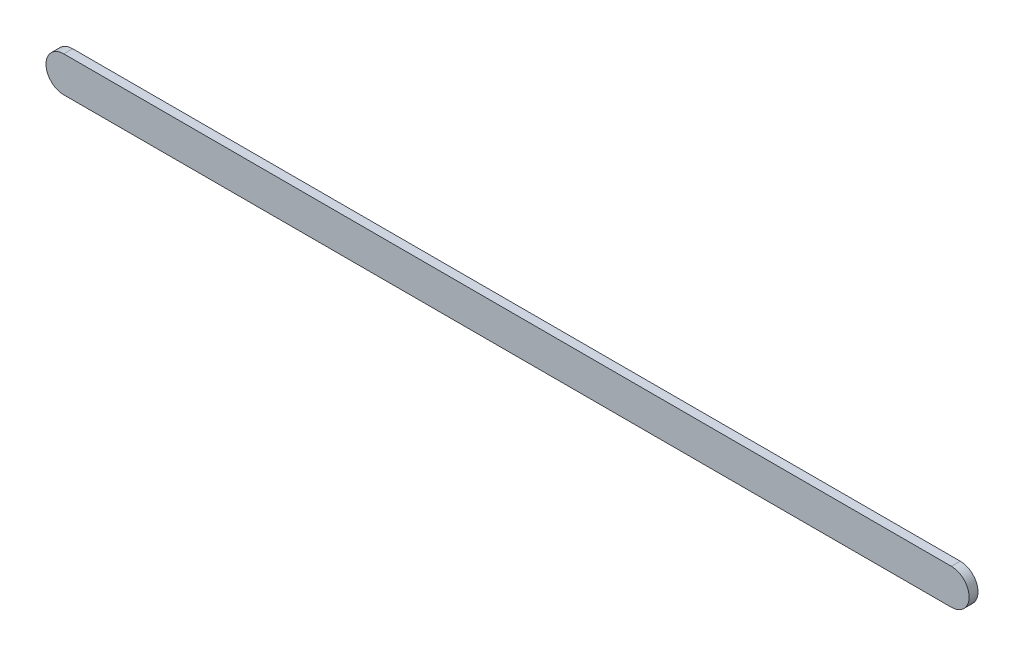
ISO-10303-21;
HEADER;
FILE_DESCRIPTION(('STEP AP214'),'2;1');
FILE_NAME('part.step','',(''),(''),'','','');
FILE_SCHEMA(('AUTOMOTIVE_DESIGN { 1 0 10303 214 1 1 1 1 }'));
ENDSEC;
DATA;
#1=APPLICATION_CONTEXT('core data for automotive mechanical design processes');
#2=APPLICATION_PROTOCOL_DEFINITION('international standard','automotive_design',2000,#1);
#3=PRODUCT_CONTEXT('',#1,'mechanical');
#4=PRODUCT('Part','Part','',(#3));
#5=PRODUCT_RELATED_PRODUCT_CATEGORY('part','',(#4));
#6=PRODUCT_DEFINITION_FORMATION('','',#4);
#7=PRODUCT_DEFINITION_CONTEXT('part definition',#1,'design');
#8=PRODUCT_DEFINITION('design','',#6,#7);
#9=PRODUCT_DEFINITION_SHAPE('','',#8);
#10=(LENGTH_UNIT() NAMED_UNIT(*) SI_UNIT(.MILLI.,.METRE.));
#11=(NAMED_UNIT(*) PLANE_ANGLE_UNIT() SI_UNIT($,.RADIAN.));
#12=(NAMED_UNIT(*) SI_UNIT($,.STERADIAN.) SOLID_ANGLE_UNIT());
#13=UNCERTAINTY_MEASURE_WITH_UNIT(LENGTH_MEASURE(1.E-05),#10,'distance_accuracy_value','');
#14=(GEOMETRIC_REPRESENTATION_CONTEXT(3) GLOBAL_UNCERTAINTY_ASSIGNED_CONTEXT((#13)) GLOBAL_UNIT_ASSIGNED_CONTEXT((#10,
#11,#12)) REPRESENTATION_CONTEXT('',''));
#15=CARTESIAN_POINT('',(0.,0.,0.));
#16=DIRECTION('',(0.,0.,1.));
#17=DIRECTION('',(1.,0.,0.));
#18=AXIS2_PLACEMENT_3D('',#15,#16,#17);
#19=CARTESIAN_POINT('',(-53.3333333333333,-5.16666666666666,2.5));
#20=DIRECTION('',(0.,0.,-1.));
#21=DIRECTION('',(-1.,0.,0.));
#22=AXIS2_PLACEMENT_3D('',#19,#20,#21);
#23=CYLINDRICAL_SURFACE('',#22,5.);
#24=CARTESIAN_POINT('',(-53.3333333333333,-5.16666666666666,0.));
#25=DIRECTION('',(0.,0.,1.));
#26=DIRECTION('',(1.,0.,0.));
#27=AXIS2_PLACEMENT_3D('',#24,#25,#26);
#28=CIRCLE('',#27,5.);
#29=CARTESIAN_POINT('',(-53.3333333333333,-0.166666666666655,0.));
#30=VERTEX_POINT('',#29);
#31=CARTESIAN_POINT('',(-53.3333333333333,-10.1666666666667,0.));
#32=VERTEX_POINT('',#31);
#33=EDGE_CURVE('E104',#30,#32,#28,.T.);
#34=ORIENTED_EDGE('',*,*,#33,.T.);
#35=DIRECTION('',(0.,0.,-1.));
#36=VECTOR('',#35,1.);
#37=CARTESIAN_POINT('',(-53.3333333333333,-10.1666666666667,2.5));
#38=LINE('',#37,#36);
#39=CARTESIAN_POINT('',(-53.3333333333333,-10.1666666666667,2.5));
#40=VERTEX_POINT('',#39);
#41=EDGE_CURVE('E11',#40,#32,#38,.T.);
#42=ORIENTED_EDGE('',*,*,#41,.F.);
#43=CARTESIAN_POINT('',(-53.3333333333333,-5.16666666666666,2.5));
#44=DIRECTION('',(0.,0.,1.));
#45=DIRECTION('',(1.,0.,0.));
#46=AXIS2_PLACEMENT_3D('',#43,#44,#45);
#47=CIRCLE('',#46,5.);
#48=CARTESIAN_POINT('',(-53.3333333333333,-0.166666666666655,2.5));
#49=VERTEX_POINT('',#48);
#50=EDGE_CURVE('E92',#49,#40,#47,.T.);
#51=ORIENTED_EDGE('',*,*,#50,.F.);
#52=DIRECTION('',(0.,0.,-1.));
#53=VECTOR('',#52,1.);
#54=CARTESIAN_POINT('',(-53.3333333333333,-0.166666666666655,2.5));
#55=LINE('',#54,#53);
#56=EDGE_CURVE('E100',#49,#30,#55,.T.);
#57=ORIENTED_EDGE('',*,*,#56,.T.);
#58=EDGE_LOOP('',(#34,#42,#51,#57));
#59=FACE_BOUND('',#58,.T.);
#60=ADVANCED_FACE('F41',(#59),#23,.T.);
#61=CARTESIAN_POINT('',(-53.3333333333333,-10.1666666666667,2.5));
#62=DIRECTION('',(0.,1.,0.));
#63=DIRECTION('',(0.,0.,1.));
#64=AXIS2_PLACEMENT_3D('',#61,#62,#63);
#65=PLANE('',#64);
#66=DIRECTION('',(1.,0.,0.));
#67=VECTOR('',#66,1.);
#68=CARTESIAN_POINT('',(-53.3333333333333,-10.1666666666667,0.));
#69=LINE('',#68,#67);
#70=CARTESIAN_POINT('',(196.666666666667,-10.1666666666667,0.));
#71=VERTEX_POINT('',#70);
#72=EDGE_CURVE('E96',#32,#71,#69,.T.);
#73=ORIENTED_EDGE('',*,*,#72,.T.);
#74=DIRECTION('',(0.,0.,-1.));
#75=VECTOR('',#74,1.);
#76=CARTESIAN_POINT('',(196.666666666667,-10.1666666666667,2.5));
#77=LINE('',#76,#75);
#78=CARTESIAN_POINT('',(196.666666666667,-10.1666666666667,2.5));
#79=VERTEX_POINT('',#78);
#80=EDGE_CURVE('E49',#79,#71,#77,.T.);
#81=ORIENTED_EDGE('',*,*,#80,.F.);
#82=DIRECTION('',(1.,0.,0.));
#83=VECTOR('',#82,1.);
#84=CARTESIAN_POINT('',(-53.3333333333333,-10.1666666666667,2.5));
#85=LINE('',#84,#83);
#86=EDGE_CURVE('E87',#40,#79,#85,.T.);
#87=ORIENTED_EDGE('',*,*,#86,.F.);
#88=ORIENTED_EDGE('',*,*,#41,.T.);
#89=EDGE_LOOP('',(#73,#81,#87,#88));
#90=FACE_BOUND('',#89,.T.);
#91=ADVANCED_FACE('F95',(#90),#65,.F.);
#92=CARTESIAN_POINT('',(196.666666666667,-5.16666666666666,2.5));
#93=DIRECTION('',(0.,0.,-1.));
#94=DIRECTION('',(-1.,0.,0.));
#95=AXIS2_PLACEMENT_3D('',#92,#93,#94);
#96=CYLINDRICAL_SURFACE('',#95,5.);
#97=CARTESIAN_POINT('',(196.666666666667,-5.16666666666666,0.));
#98=DIRECTION('',(0.,0.,1.));
#99=DIRECTION('',(1.,0.,0.));
#100=AXIS2_PLACEMENT_3D('',#97,#98,#99);
#101=CIRCLE('',#100,5.);
#102=CARTESIAN_POINT('',(196.666666666667,-0.166666666666655,0.));
#103=VERTEX_POINT('',#102);
#104=EDGE_CURVE('E74',#71,#103,#101,.T.);
#105=ORIENTED_EDGE('',*,*,#104,.T.);
#106=DIRECTION('',(0.,0.,-1.));
#107=VECTOR('',#106,1.);
#108=CARTESIAN_POINT('',(196.666666666667,-0.166666666666655,2.5));
#109=LINE('',#108,#107);
#110=CARTESIAN_POINT('',(196.666666666667,-0.166666666666655,2.5));
#111=VERTEX_POINT('',#110);
#112=EDGE_CURVE('E97',#111,#103,#109,.T.);
#113=ORIENTED_EDGE('',*,*,#112,.F.);
#114=CARTESIAN_POINT('',(196.666666666667,-5.16666666666666,2.5));
#115=DIRECTION('',(0.,0.,1.));
#116=DIRECTION('',(1.,0.,0.));
#117=AXIS2_PLACEMENT_3D('',#114,#115,#116);
#118=CIRCLE('',#117,5.);
#119=EDGE_CURVE('E90',#79,#111,#118,.T.);
#120=ORIENTED_EDGE('',*,*,#119,.F.);
#121=ORIENTED_EDGE('',*,*,#80,.T.);
#122=EDGE_LOOP('',(#105,#113,#120,#121));
#123=FACE_BOUND('',#122,.T.);
#124=ADVANCED_FACE('F98',(#123),#96,.T.);
#125=CARTESIAN_POINT('',(-53.3333333333333,-0.166666666666655,2.5));
#126=DIRECTION('',(0.,-1.,0.));
#127=DIRECTION('',(0.,0.,-1.));
#128=AXIS2_PLACEMENT_3D('',#125,#126,#127);
#129=PLANE('',#128);
#130=DIRECTION('',(-1.,0.,0.));
#131=VECTOR('',#130,1.);
#132=CARTESIAN_POINT('',(-53.3333333333333,-0.166666666666655,0.));
#133=LINE('',#132,#131);
#134=EDGE_CURVE('E80',#103,#30,#133,.T.);
#135=ORIENTED_EDGE('',*,*,#134,.T.);
#136=ORIENTED_EDGE('',*,*,#56,.F.);
#137=DIRECTION('',(-1.,0.,0.));
#138=VECTOR('',#137,1.);
#139=CARTESIAN_POINT('',(-53.3333333333333,-0.166666666666655,2.5));
#140=LINE('',#139,#138);
#141=EDGE_CURVE('E57',#111,#49,#140,.T.);
#142=ORIENTED_EDGE('',*,*,#141,.F.);
#143=ORIENTED_EDGE('',*,*,#112,.T.);
#144=EDGE_LOOP('',(#135,#136,#142,#143));
#145=FACE_BOUND('',#144,.T.);
#146=ADVANCED_FACE('F111',(#145),#129,.F.);
#147=CARTESIAN_POINT('',(-53.3333333333333,-5.16666666666666,2.5));
#148=DIRECTION('',(0.,0.,1.));
#149=DIRECTION('',(1.,0.,0.));
#150=AXIS2_PLACEMENT_3D('',#147,#148,#149);
#151=PLANE('',#150);
#152=ORIENTED_EDGE('',*,*,#50,.T.);
#153=ORIENTED_EDGE('',*,*,#86,.T.);
#154=ORIENTED_EDGE('',*,*,#119,.T.);
#155=ORIENTED_EDGE('',*,*,#141,.T.);
#156=EDGE_LOOP('',(#152,#153,#154,#155));
#157=FACE_BOUND('',#156,.T.);
#158=ADVANCED_FACE('F88',(#157),#151,.T.);
#159=CARTESIAN_POINT('',(-53.3333333333333,-5.16666666666666,0.));
#160=DIRECTION('',(0.,0.,1.));
#161=DIRECTION('',(1.,0.,0.));
#162=AXIS2_PLACEMENT_3D('',#159,#160,#161);
#163=PLANE('',#162);
#164=ORIENTED_EDGE('',*,*,#33,.F.);
#165=ORIENTED_EDGE('',*,*,#134,.F.);
#166=ORIENTED_EDGE('',*,*,#104,.F.);
#167=ORIENTED_EDGE('',*,*,#72,.F.);
#168=EDGE_LOOP('',(#164,#165,#166,#167));
#169=FACE_BOUND('',#168,.T.);
#170=ADVANCED_FACE('F114',(#169),#163,.F.);
#171=CLOSED_SHELL('',(#60,#91,#124,#146,#158,#170));
#172=MANIFOLD_SOLID_BREP('B2',#171);
#173=ADVANCED_BREP_SHAPE_REPRESENTATION('',(#18,#172),#14);
#174=SHAPE_DEFINITION_REPRESENTATION(#9,#173);
ENDSEC;
END-ISO-10303-21;
